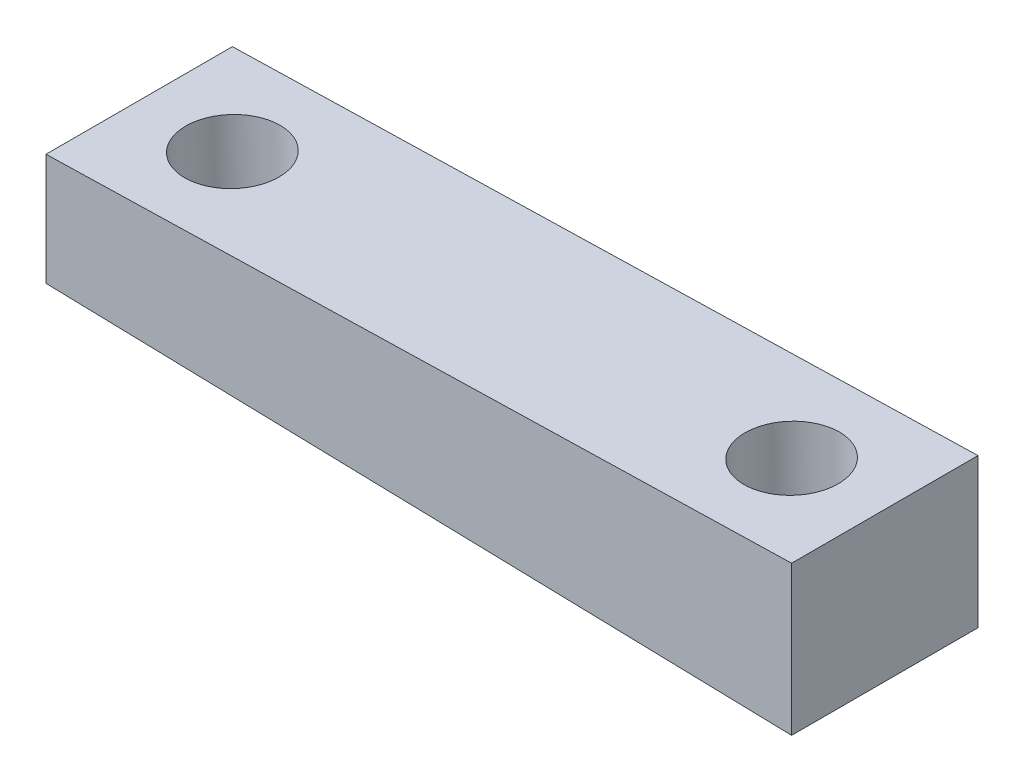
ISO-10303-21;
HEADER;
FILE_DESCRIPTION(('STEP AP214'),'2;1');
FILE_NAME('part.step','',(''),(''),'','','');
FILE_SCHEMA(('AUTOMOTIVE_DESIGN { 1 0 10303 214 1 1 1 1 }'));
ENDSEC;
DATA;
#1=APPLICATION_CONTEXT('core data for automotive mechanical design processes');
#2=APPLICATION_PROTOCOL_DEFINITION('international standard','automotive_design',2000,#1);
#3=PRODUCT_CONTEXT('',#1,'mechanical');
#4=PRODUCT('Part','Part','',(#3));
#5=PRODUCT_RELATED_PRODUCT_CATEGORY('part','',(#4));
#6=PRODUCT_DEFINITION_FORMATION('','',#4);
#7=PRODUCT_DEFINITION_CONTEXT('part definition',#1,'design');
#8=PRODUCT_DEFINITION('design','',#6,#7);
#9=PRODUCT_DEFINITION_SHAPE('','',#8);
#10=(LENGTH_UNIT() NAMED_UNIT(*) SI_UNIT(.MILLI.,.METRE.));
#11=(NAMED_UNIT(*) PLANE_ANGLE_UNIT() SI_UNIT($,.RADIAN.));
#12=(NAMED_UNIT(*) SI_UNIT($,.STERADIAN.) SOLID_ANGLE_UNIT());
#13=UNCERTAINTY_MEASURE_WITH_UNIT(LENGTH_MEASURE(1.E-05),#10,'distance_accuracy_value','');
#14=(GEOMETRIC_REPRESENTATION_CONTEXT(3) GLOBAL_UNCERTAINTY_ASSIGNED_CONTEXT((#13)) GLOBAL_UNIT_ASSIGNED_CONTEXT((#10,
#11,#12)) REPRESENTATION_CONTEXT('',''));
#15=CARTESIAN_POINT('',(0.,0.,0.));
#16=DIRECTION('',(0.,0.,1.));
#17=DIRECTION('',(1.,0.,0.));
#18=AXIS2_PLACEMENT_3D('',#15,#16,#17);
#19=CARTESIAN_POINT('',(0.,-6.,10.));
#20=DIRECTION('',(1.,0.,0.));
#21=DIRECTION('',(0.,0.,-1.));
#22=AXIS2_PLACEMENT_3D('',#19,#20,#21);
#23=PLANE('',#22);
#24=DIRECTION('',(0.,-1.,0.));
#25=VECTOR('',#24,1.);
#26=CARTESIAN_POINT('',(0.,-6.,0.));
#27=LINE('',#26,#25);
#28=CARTESIAN_POINT('',(0.,0.,0.));
#29=VERTEX_POINT('',#28);
#30=CARTESIAN_POINT('',(0.,-6.,0.));
#31=VERTEX_POINT('',#30);
#32=EDGE_CURVE('E96',#29,#31,#27,.T.);
#33=ORIENTED_EDGE('',*,*,#32,.T.);
#34=DIRECTION('',(0.,0.,-1.));
#35=VECTOR('',#34,1.);
#36=CARTESIAN_POINT('',(0.,-6.,10.));
#37=LINE('',#36,#35);
#38=CARTESIAN_POINT('',(0.,-6.,10.));
#39=VERTEX_POINT('',#38);
#40=EDGE_CURVE('E11',#39,#31,#37,.T.);
#41=ORIENTED_EDGE('',*,*,#40,.F.);
#42=DIRECTION('',(0.,-1.,0.));
#43=VECTOR('',#42,1.);
#44=CARTESIAN_POINT('',(0.,-6.,10.));
#45=LINE('',#44,#43);
#46=CARTESIAN_POINT('',(0.,0.,10.));
#47=VERTEX_POINT('',#46);
#48=EDGE_CURVE('E84',#47,#39,#45,.T.);
#49=ORIENTED_EDGE('',*,*,#48,.F.);
#50=DIRECTION('',(0.,0.,-1.));
#51=VECTOR('',#50,1.);
#52=CARTESIAN_POINT('',(0.,0.,10.));
#53=LINE('',#52,#51);
#54=EDGE_CURVE('E92',#47,#29,#53,.T.);
#55=ORIENTED_EDGE('',*,*,#54,.T.);
#56=EDGE_LOOP('',(#33,#41,#49,#55));
#57=FACE_BOUND('',#56,.T.);
#58=ADVANCED_FACE('F33',(#57),#23,.F.);
#59=CARTESIAN_POINT('',(40.,-6.99999999999999,10.));
#60=DIRECTION('',(0.0249921911602029,0.999687646408123,0.));
#61=DIRECTION('',(-0.999687646408123,0.0249921911602029,0.));
#62=AXIS2_PLACEMENT_3D('',#59,#60,#61);
#63=PLANE('',#62);
#64=CARTESIAN_POINT('',(35.1954348908711,-6.87988587227177,5.));
#65=DIRECTION('',(0.0249921911602029,0.999687646408123,0.));
#66=DIRECTION('',(-0.999687646408123,0.0249921911602029,0.));
#67=AXIS2_PLACEMENT_3D('',#64,#65,#66);
#68=ELLIPSE('',#67,2.50312695434647,2.5);
#69=CARTESIAN_POINT('',(32.6930897972198,-6.81732724493049,5.));
#70=VERTEX_POINT('',#69);
#71=EDGE_CURVE('E115',#70,#70,#68,.T.);
#72=ORIENTED_EDGE('',*,*,#71,.T.);
#73=EDGE_LOOP('',(#72));
#74=FACE_BOUND('',#73,.T.);
#75=CARTESIAN_POINT('',(5.1547839959331,-6.12886959989833,5.));
#76=DIRECTION('',(0.0249921911602029,0.999687646408123,0.));
#77=DIRECTION('',(-0.999687646408123,0.0249921911602029,0.));
#78=AXIS2_PLACEMENT_3D('',#75,#76,#77);
#79=ELLIPSE('',#78,2.50312695434647,2.5);
#80=CARTESIAN_POINT('',(2.65243890228174,-6.06631097255704,5.));
#81=VERTEX_POINT('',#80);
#82=EDGE_CURVE('E99',#81,#81,#79,.T.);
#83=ORIENTED_EDGE('',*,*,#82,.T.);
#84=EDGE_LOOP('',(#83));
#85=FACE_BOUND('',#84,.T.);
#86=DIRECTION('',(0.999687646408123,-0.0249921911602029,0.));
#87=VECTOR('',#86,1.);
#88=CARTESIAN_POINT('',(40.,-6.99999999999999,0.));
#89=LINE('',#88,#87);
#90=CARTESIAN_POINT('',(40.,-6.99999999999999,0.));
#91=VERTEX_POINT('',#90);
#92=EDGE_CURVE('E88',#31,#91,#89,.T.);
#93=ORIENTED_EDGE('',*,*,#92,.T.);
#94=DIRECTION('',(0.,0.,-1.));
#95=VECTOR('',#94,1.);
#96=CARTESIAN_POINT('',(40.,-6.99999999999999,10.));
#97=LINE('',#96,#95);
#98=CARTESIAN_POINT('',(40.,-6.99999999999999,10.));
#99=VERTEX_POINT('',#98);
#100=EDGE_CURVE('E41',#99,#91,#97,.T.);
#101=ORIENTED_EDGE('',*,*,#100,.F.);
#102=DIRECTION('',(0.999687646408123,-0.0249921911602029,0.));
#103=VECTOR('',#102,1.);
#104=CARTESIAN_POINT('',(40.,-6.99999999999999,10.));
#105=LINE('',#104,#103);
#106=EDGE_CURVE('E79',#39,#99,#105,.T.);
#107=ORIENTED_EDGE('',*,*,#106,.F.);
#108=ORIENTED_EDGE('',*,*,#40,.T.);
#109=EDGE_LOOP('',(#93,#101,#107,#108));
#110=FACE_BOUND('',#109,.T.);
#111=ADVANCED_FACE('F87',(#74,#85,#110),#63,.F.);
#112=CARTESIAN_POINT('',(40.,1.00000000000001,10.));
#113=DIRECTION('',(-1.,0.,0.));
#114=DIRECTION('',(0.,0.,1.));
#115=AXIS2_PLACEMENT_3D('',#112,#113,#114);
#116=PLANE('',#115);
#117=DIRECTION('',(0.,1.,0.));
#118=VECTOR('',#117,1.);
#119=CARTESIAN_POINT('',(40.,1.00000000000001,0.));
#120=LINE('',#119,#118);
#121=CARTESIAN_POINT('',(40.,1.00000000000001,0.));
#122=VERTEX_POINT('',#121);
#123=EDGE_CURVE('E66',#91,#122,#120,.T.);
#124=ORIENTED_EDGE('',*,*,#123,.T.);
#125=DIRECTION('',(0.,0.,-1.));
#126=VECTOR('',#125,1.);
#127=CARTESIAN_POINT('',(40.,1.00000000000001,10.));
#128=LINE('',#127,#126);
#129=CARTESIAN_POINT('',(40.,1.00000000000001,10.));
#130=VERTEX_POINT('',#129);
#131=EDGE_CURVE('E89',#130,#122,#128,.T.);
#132=ORIENTED_EDGE('',*,*,#131,.F.);
#133=DIRECTION('',(0.,1.,0.));
#134=VECTOR('',#133,1.);
#135=CARTESIAN_POINT('',(40.,1.00000000000001,10.));
#136=LINE('',#135,#134);
#137=EDGE_CURVE('E82',#99,#130,#136,.T.);
#138=ORIENTED_EDGE('',*,*,#137,.F.);
#139=ORIENTED_EDGE('',*,*,#100,.T.);
#140=EDGE_LOOP('',(#124,#132,#138,#139));
#141=FACE_BOUND('',#140,.T.);
#142=ADVANCED_FACE('F90',(#141),#116,.F.);
#143=CARTESIAN_POINT('',(0.,0.,10.));
#144=DIRECTION('',(0.0249921911602032,-0.999687646408123,0.));
#145=DIRECTION('',(0.999687646408123,0.0249921911602032,0.));
#146=AXIS2_PLACEMENT_3D('',#143,#144,#145);
#147=PLANE('',#146);
#148=CARTESIAN_POINT('',(35.0015617679594,0.87503904419899,5.));
#149=DIRECTION('',(-0.0249921911602032,0.999687646408123,0.));
#150=DIRECTION('',(-0.999687646408123,-0.0249921911602032,0.));
#151=AXIS2_PLACEMENT_3D('',#148,#149,#150);
#152=CIRCLE('',#151,2.5);
#153=CARTESIAN_POINT('',(32.5023426519391,0.812558566298482,5.));
#154=VERTEX_POINT('',#153);
#155=EDGE_CURVE('E118',#154,#154,#152,.T.);
#156=ORIENTED_EDGE('',*,*,#155,.F.);
#157=EDGE_LOOP('',(#156));
#158=FACE_BOUND('',#157,.T.);
#159=CARTESIAN_POINT('',(4.99843823204061,0.124960955801016,5.));
#160=DIRECTION('',(-0.0249921911602032,0.999687646408123,0.));
#161=DIRECTION('',(-0.999687646408123,-0.0249921911602032,0.));
#162=AXIS2_PLACEMENT_3D('',#159,#160,#161);
#163=CIRCLE('',#162,2.5);
#164=CARTESIAN_POINT('',(2.4992191160203,0.062480477900508,5.));
#165=VERTEX_POINT('',#164);
#166=EDGE_CURVE('E112',#165,#165,#163,.T.);
#167=ORIENTED_EDGE('',*,*,#166,.F.);
#168=EDGE_LOOP('',(#167));
#169=FACE_BOUND('',#168,.T.);
#170=DIRECTION('',(-0.999687646408123,-0.0249921911602032,0.));
#171=VECTOR('',#170,1.);
#172=CARTESIAN_POINT('',(0.,0.,0.));
#173=LINE('',#172,#171);
#174=EDGE_CURVE('E72',#122,#29,#173,.T.);
#175=ORIENTED_EDGE('',*,*,#174,.T.);
#176=ORIENTED_EDGE('',*,*,#54,.F.);
#177=DIRECTION('',(-0.999687646408123,-0.0249921911602032,0.));
#178=VECTOR('',#177,1.);
#179=CARTESIAN_POINT('',(0.,0.,10.));
#180=LINE('',#179,#178);
#181=EDGE_CURVE('E49',#130,#47,#180,.T.);
#182=ORIENTED_EDGE('',*,*,#181,.F.);
#183=ORIENTED_EDGE('',*,*,#131,.T.);
#184=EDGE_LOOP('',(#175,#176,#182,#183));
#185=FACE_BOUND('',#184,.T.);
#186=ADVANCED_FACE('F104',(#158,#169,#185),#147,.F.);
#187=CARTESIAN_POINT('',(0.,0.,10.));
#188=DIRECTION('',(0.,0.,-1.));
#189=DIRECTION('',(-1.,0.,0.));
#190=AXIS2_PLACEMENT_3D('',#187,#188,#189);
#191=PLANE('',#190);
#192=ORIENTED_EDGE('',*,*,#48,.T.);
#193=ORIENTED_EDGE('',*,*,#106,.T.);
#194=ORIENTED_EDGE('',*,*,#137,.T.);
#195=ORIENTED_EDGE('',*,*,#181,.T.);
#196=EDGE_LOOP('',(#192,#193,#194,#195));
#197=FACE_BOUND('',#196,.T.);
#198=ADVANCED_FACE('F80',(#197),#191,.F.);
#199=CARTESIAN_POINT('',(0.,0.,0.));
#200=DIRECTION('',(0.,0.,-1.));
#201=DIRECTION('',(-1.,0.,0.));
#202=AXIS2_PLACEMENT_3D('',#199,#200,#201);
#203=PLANE('',#202);
#204=ORIENTED_EDGE('',*,*,#32,.F.);
#205=ORIENTED_EDGE('',*,*,#174,.F.);
#206=ORIENTED_EDGE('',*,*,#123,.F.);
#207=ORIENTED_EDGE('',*,*,#92,.F.);
#208=EDGE_LOOP('',(#204,#205,#206,#207));
#209=FACE_BOUND('',#208,.T.);
#210=ADVANCED_FACE('F107',(#209),#203,.T.);
#211=CARTESIAN_POINT('',(5.19831331011682,-7.87004216724708,5.));
#212=DIRECTION('',(-0.0249921911602032,0.999687646408123,0.));
#213=DIRECTION('',(-0.999687646408123,-0.0249921911602032,0.));
#214=AXIS2_PLACEMENT_3D('',#211,#212,#213);
#215=CYLINDRICAL_SURFACE('',#214,2.5);
#216=ORIENTED_EDGE('',*,*,#166,.T.);
#217=EDGE_LOOP('',(#216));
#218=FACE_BOUND('',#217,.T.);
#219=ORIENTED_EDGE('',*,*,#82,.F.);
#220=EDGE_LOOP('',(#219));
#221=FACE_BOUND('',#220,.T.);
#222=ADVANCED_FACE('F130',(#218,#221),#215,.F.);
#223=CARTESIAN_POINT('',(35.2014368460356,-7.1199640788491,5.));
#224=DIRECTION('',(-0.0249921911602032,0.999687646408123,0.));
#225=DIRECTION('',(-0.999687646408123,-0.0249921911602032,0.));
#226=AXIS2_PLACEMENT_3D('',#223,#224,#225);
#227=CYLINDRICAL_SURFACE('',#226,2.5);
#228=ORIENTED_EDGE('',*,*,#155,.T.);
#229=EDGE_LOOP('',(#228));
#230=FACE_BOUND('',#229,.T.);
#231=ORIENTED_EDGE('',*,*,#71,.F.);
#232=EDGE_LOOP('',(#231));
#233=FACE_BOUND('',#232,.T.);
#234=ADVANCED_FACE('F122',(#230,#233),#227,.F.);
#235=CLOSED_SHELL('',(#58,#111,#142,#186,#198,#210,#222,#234));
#236=MANIFOLD_SOLID_BREP('B2',#235);
#237=ADVANCED_BREP_SHAPE_REPRESENTATION('',(#18,#236),#14);
#238=SHAPE_DEFINITION_REPRESENTATION(#9,#237);
ENDSEC;
END-ISO-10303-21;
